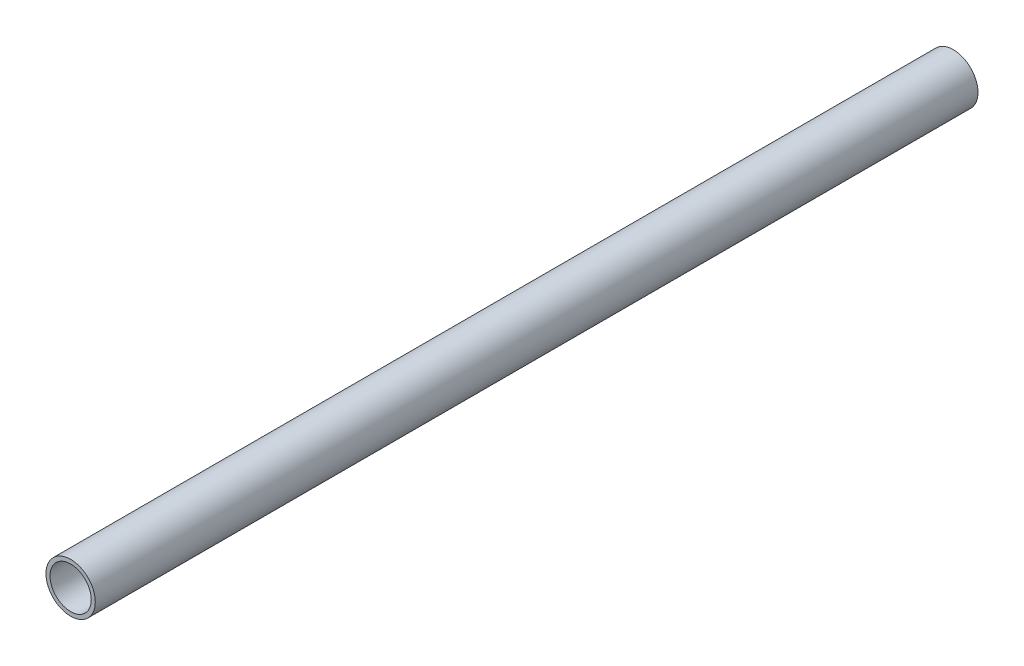
ISO-10303-21;
HEADER;
FILE_DESCRIPTION(('STEP AP214'),'2;1');
FILE_NAME('part.step','',(''),(''),'','','');
FILE_SCHEMA(('AUTOMOTIVE_DESIGN { 1 0 10303 214 1 1 1 1 }'));
ENDSEC;
DATA;
#1=APPLICATION_CONTEXT('core data for automotive mechanical design processes');
#2=APPLICATION_PROTOCOL_DEFINITION('international standard','automotive_design',2000,#1);
#3=PRODUCT_CONTEXT('',#1,'mechanical');
#4=PRODUCT('Part','Part','',(#3));
#5=PRODUCT_RELATED_PRODUCT_CATEGORY('part','',(#4));
#6=PRODUCT_DEFINITION_FORMATION('','',#4);
#7=PRODUCT_DEFINITION_CONTEXT('part definition',#1,'design');
#8=PRODUCT_DEFINITION('design','',#6,#7);
#9=PRODUCT_DEFINITION_SHAPE('','',#8);
#10=(LENGTH_UNIT() NAMED_UNIT(*) SI_UNIT(.MILLI.,.METRE.));
#11=(NAMED_UNIT(*) PLANE_ANGLE_UNIT() SI_UNIT($,.RADIAN.));
#12=(NAMED_UNIT(*) SI_UNIT($,.STERADIAN.) SOLID_ANGLE_UNIT());
#13=UNCERTAINTY_MEASURE_WITH_UNIT(LENGTH_MEASURE(1.E-05),#10,'distance_accuracy_value','');
#14=(GEOMETRIC_REPRESENTATION_CONTEXT(3) GLOBAL_UNCERTAINTY_ASSIGNED_CONTEXT((#13)) GLOBAL_UNIT_ASSIGNED_CONTEXT((#10,
#11,#12)) REPRESENTATION_CONTEXT('',''));
#15=CARTESIAN_POINT('',(0.,0.,0.));
#16=DIRECTION('',(0.,0.,1.));
#17=DIRECTION('',(1.,0.,0.));
#18=AXIS2_PLACEMENT_3D('',#15,#16,#17);
#19=CARTESIAN_POINT('',(0.,0.,863.6));
#20=DIRECTION('',(0.,0.,1.));
#21=DIRECTION('',(1.,0.,0.));
#22=AXIS2_PLACEMENT_3D('',#19,#20,#21);
#23=PLANE('',#22);
#24=CARTESIAN_POINT('',(0.,0.,863.6));
#25=DIRECTION('',(0.,0.,1.));
#26=DIRECTION('',(1.,0.,0.));
#27=AXIS2_PLACEMENT_3D('',#24,#25,#26);
#28=CIRCLE('',#27,24.13);
#29=CARTESIAN_POINT('',(24.13,0.,863.6));
#30=VERTEX_POINT('',#29);
#31=EDGE_CURVE('E10',#30,#30,#28,.T.);
#32=ORIENTED_EDGE('',*,*,#31,.T.);
#33=EDGE_LOOP('',(#32));
#34=FACE_BOUND('',#33,.T.);
#35=CARTESIAN_POINT('',(0.,0.,863.6));
#36=DIRECTION('',(0.,0.,1.));
#37=DIRECTION('',(1.,0.,0.));
#38=AXIS2_PLACEMENT_3D('',#35,#36,#37);
#39=CIRCLE('',#38,20.193);
#40=CARTESIAN_POINT('',(20.193,0.,863.6));
#41=VERTEX_POINT('',#40);
#42=EDGE_CURVE('E42',#41,#41,#39,.T.);
#43=ORIENTED_EDGE('',*,*,#42,.F.);
#44=EDGE_LOOP('',(#43));
#45=FACE_BOUND('',#44,.T.);
#46=ADVANCED_FACE('F31',(#34,#45),#23,.T.);
#47=CARTESIAN_POINT('',(0.,0.,0.));
#48=DIRECTION('',(0.,0.,1.));
#49=DIRECTION('',(1.,0.,0.));
#50=AXIS2_PLACEMENT_3D('',#47,#48,#49);
#51=PLANE('',#50);
#52=CARTESIAN_POINT('',(0.,0.,0.));
#53=DIRECTION('',(0.,0.,1.));
#54=DIRECTION('',(1.,0.,0.));
#55=AXIS2_PLACEMENT_3D('',#52,#53,#54);
#56=CIRCLE('',#55,24.13);
#57=CARTESIAN_POINT('',(24.13,0.,0.));
#58=VERTEX_POINT('',#57);
#59=EDGE_CURVE('E35',#58,#58,#56,.T.);
#60=ORIENTED_EDGE('',*,*,#59,.F.);
#61=EDGE_LOOP('',(#60));
#62=FACE_BOUND('',#61,.T.);
#63=CARTESIAN_POINT('',(0.,0.,0.));
#64=DIRECTION('',(0.,0.,1.));
#65=DIRECTION('',(1.,0.,0.));
#66=AXIS2_PLACEMENT_3D('',#63,#64,#65);
#67=CIRCLE('',#66,20.193);
#68=CARTESIAN_POINT('',(20.193,0.,0.));
#69=VERTEX_POINT('',#68);
#70=EDGE_CURVE('E44',#69,#69,#67,.T.);
#71=ORIENTED_EDGE('',*,*,#70,.T.);
#72=EDGE_LOOP('',(#71));
#73=FACE_BOUND('',#72,.T.);
#74=ADVANCED_FACE('F54',(#62,#73),#51,.F.);
#75=CARTESIAN_POINT('',(0.,0.,863.6));
#76=DIRECTION('',(0.,0.,-1.));
#77=DIRECTION('',(-1.,0.,0.));
#78=AXIS2_PLACEMENT_3D('',#75,#76,#77);
#79=CYLINDRICAL_SURFACE('',#78,24.13);
#80=ORIENTED_EDGE('',*,*,#31,.F.);
#81=EDGE_LOOP('',(#80));
#82=FACE_BOUND('',#81,.T.);
#83=ORIENTED_EDGE('',*,*,#59,.T.);
#84=EDGE_LOOP('',(#83));
#85=FACE_BOUND('',#84,.T.);
#86=ADVANCED_FACE('F33',(#82,#85),#79,.T.);
#87=CARTESIAN_POINT('',(0.,0.,863.6));
#88=DIRECTION('',(0.,0.,-1.));
#89=DIRECTION('',(-1.,0.,0.));
#90=AXIS2_PLACEMENT_3D('',#87,#88,#89);
#91=CYLINDRICAL_SURFACE('',#90,20.193);
#92=ORIENTED_EDGE('',*,*,#42,.T.);
#93=EDGE_LOOP('',(#92));
#94=FACE_BOUND('',#93,.T.);
#95=ORIENTED_EDGE('',*,*,#70,.F.);
#96=EDGE_LOOP('',(#95));
#97=FACE_BOUND('',#96,.T.);
#98=ADVANCED_FACE('F50',(#94,#97),#91,.F.);
#99=CLOSED_SHELL('',(#46,#74,#86,#98));
#100=MANIFOLD_SOLID_BREP('B2',#99);
#101=ADVANCED_BREP_SHAPE_REPRESENTATION('',(#18,#100),#14);
#102=SHAPE_DEFINITION_REPRESENTATION(#9,#101);
ENDSEC;
END-ISO-10303-21;
